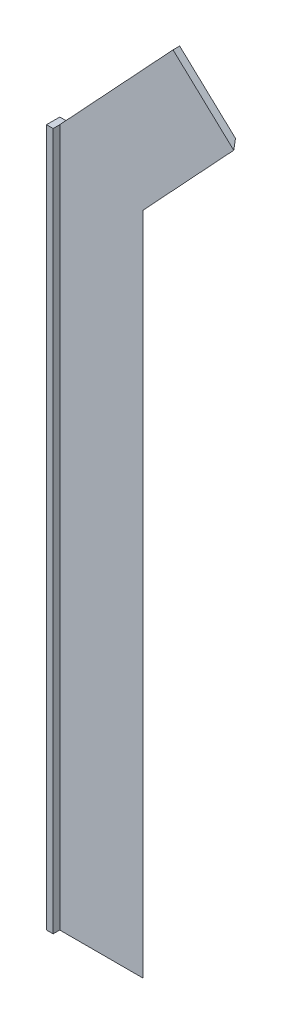
ISO-10303-21;
HEADER;
FILE_DESCRIPTION(('STEP AP214'),'2;1');
FILE_NAME('part.step','',(''),(''),'','','');
FILE_SCHEMA(('AUTOMOTIVE_DESIGN { 1 0 10303 214 1 1 1 1 }'));
ENDSEC;
DATA;
#1=APPLICATION_CONTEXT('core data for automotive mechanical design processes');
#2=APPLICATION_PROTOCOL_DEFINITION('international standard','automotive_design',2000,#1);
#3=PRODUCT_CONTEXT('',#1,'mechanical');
#4=PRODUCT('Part','Part','',(#3));
#5=PRODUCT_RELATED_PRODUCT_CATEGORY('part','',(#4));
#6=PRODUCT_DEFINITION_FORMATION('','',#4);
#7=PRODUCT_DEFINITION_CONTEXT('part definition',#1,'design');
#8=PRODUCT_DEFINITION('design','',#6,#7);
#9=PRODUCT_DEFINITION_SHAPE('','',#8);
#10=(LENGTH_UNIT() NAMED_UNIT(*) SI_UNIT(.MILLI.,.METRE.));
#11=(NAMED_UNIT(*) PLANE_ANGLE_UNIT() SI_UNIT($,.RADIAN.));
#12=(NAMED_UNIT(*) SI_UNIT($,.STERADIAN.) SOLID_ANGLE_UNIT());
#13=UNCERTAINTY_MEASURE_WITH_UNIT(LENGTH_MEASURE(1.E-05),#10,'distance_accuracy_value','');
#14=(GEOMETRIC_REPRESENTATION_CONTEXT(3) GLOBAL_UNCERTAINTY_ASSIGNED_CONTEXT((#13)) GLOBAL_UNIT_ASSIGNED_CONTEXT((#10,
#11,#12)) REPRESENTATION_CONTEXT('',''));
#15=CARTESIAN_POINT('',(0.,0.,0.));
#16=DIRECTION('',(0.,0.,1.));
#17=DIRECTION('',(1.,0.,0.));
#18=AXIS2_PLACEMENT_3D('',#15,#16,#17);
#19=CARTESIAN_POINT('',(0.,50.4323149190414,2.));
#20=DIRECTION('',(0.,1.,0.));
#21=DIRECTION('',(-1.,0.,0.));
#22=AXIS2_PLACEMENT_3D('',#19,#20,#21);
#23=PLANE('',#22);
#24=DIRECTION('',(1.,0.,0.));
#25=VECTOR('',#24,1.);
#26=CARTESIAN_POINT('',(0.,50.4323149190414,0.));
#27=LINE('',#26,#25);
#28=CARTESIAN_POINT('',(-2.,50.4323149190414,0.));
#29=VERTEX_POINT('',#28);
#30=CARTESIAN_POINT('',(23.,50.4323149190415,0.));
#31=VERTEX_POINT('',#30);
#32=EDGE_CURVE('E97',#29,#31,#27,.T.);
#33=ORIENTED_EDGE('',*,*,#32,.T.);
#34=DIRECTION('',(0.707106781186543,0.,0.707106781186552));
#35=VECTOR('',#34,1.);
#36=CARTESIAN_POINT('',(25.,50.4323149190415,2.));
#37=LINE('',#36,#35);
#38=CARTESIAN_POINT('',(25.,50.4323149190415,2.));
#39=VERTEX_POINT('',#38);
#40=EDGE_CURVE('E11',#31,#39,#37,.T.);
#41=ORIENTED_EDGE('',*,*,#40,.T.);
#42=DIRECTION('',(1.,0.,0.));
#43=VECTOR('',#42,1.);
#44=CARTESIAN_POINT('',(0.,50.4323149190414,2.));
#45=LINE('',#44,#43);
#46=CARTESIAN_POINT('',(0.,50.4323149190414,2.));
#47=VERTEX_POINT('',#46);
#48=EDGE_CURVE('E144',#47,#39,#45,.T.);
#49=ORIENTED_EDGE('',*,*,#48,.F.);
#50=DIRECTION('',(0.,0.,1.));
#51=VECTOR('',#50,1.);
#52=CARTESIAN_POINT('',(0.,50.4323149190414,0.));
#53=LINE('',#52,#51);
#54=CARTESIAN_POINT('',(0.,50.4323149190414,4.00000000000003));
#55=VERTEX_POINT('',#54);
#56=EDGE_CURVE('E132',#47,#55,#53,.T.);
#57=ORIENTED_EDGE('',*,*,#56,.T.);
#58=DIRECTION('',(1.,0.,0.));
#59=VECTOR('',#58,1.);
#60=CARTESIAN_POINT('',(-2.,50.4323149190414,4.00000000000003));
#61=LINE('',#60,#59);
#62=CARTESIAN_POINT('',(-2.,50.4323149190414,4.00000000000003));
#63=VERTEX_POINT('',#62);
#64=EDGE_CURVE('E106',#63,#55,#61,.T.);
#65=ORIENTED_EDGE('',*,*,#64,.F.);
#66=DIRECTION('',(0.,0.,1.));
#67=VECTOR('',#66,1.);
#68=CARTESIAN_POINT('',(-2.,50.4323149190414,0.));
#69=LINE('',#68,#67);
#70=EDGE_CURVE('E109',#29,#63,#69,.T.);
#71=ORIENTED_EDGE('',*,*,#70,.F.);
#72=EDGE_LOOP('',(#33,#41,#49,#57,#65,#71));
#73=FACE_BOUND('',#72,.T.);
#74=ADVANCED_FACE('F33',(#73),#23,.F.);
#75=CARTESIAN_POINT('',(34.0999180031248,297.,2.));
#76=DIRECTION('',(-0.681998360062497,-0.731353701619172,0.));
#77=DIRECTION('',(0.731353701619172,-0.681998360062497,0.));
#78=AXIS2_PLACEMENT_3D('',#75,#76,#77);
#79=PLANE('',#78);
#80=DIRECTION('',(-0.731353701619172,0.681998360062497,0.));
#81=VECTOR('',#80,1.);
#82=CARTESIAN_POINT('',(34.0999180031248,297.,2.));
#83=LINE('',#82,#81);
#84=CARTESIAN_POINT('',(52.3837605436042,279.950040998437,2.));
#85=VERTEX_POINT('',#84);
#86=CARTESIAN_POINT('',(34.0999180031248,297.,2.));
#87=VERTEX_POINT('',#86);
#88=EDGE_CURVE('E152',#85,#87,#83,.T.);
#89=ORIENTED_EDGE('',*,*,#88,.F.);
#90=DIRECTION('',(-0.517145161860798,0.482245665158295,-0.70710678118655));
#91=VECTOR('',#90,1.);
#92=CARTESIAN_POINT('',(52.3837605436042,279.950040998437,2.00000000000003));
#93=LINE('',#92,#91);
#94=CARTESIAN_POINT('',(50.9210531403658,281.314037718563,0.));
#95=VERTEX_POINT('',#94);
#96=EDGE_CURVE('E159',#85,#95,#93,.T.);
#97=ORIENTED_EDGE('',*,*,#96,.T.);
#98=DIRECTION('',(-0.731353701619172,0.681998360062497,0.));
#99=VECTOR('',#98,1.);
#100=CARTESIAN_POINT('',(34.0999180031248,297.,0.));
#101=LINE('',#100,#99);
#102=CARTESIAN_POINT('',(34.0999180031248,297.,0.));
#103=VERTEX_POINT('',#102);
#104=EDGE_CURVE('E105',#95,#103,#101,.T.);
#105=ORIENTED_EDGE('',*,*,#104,.T.);
#106=DIRECTION('',(0.,0.,-1.));
#107=VECTOR('',#106,1.);
#108=CARTESIAN_POINT('',(34.0999180031248,297.,2.));
#109=LINE('',#108,#107);
#110=EDGE_CURVE('E156',#87,#103,#109,.T.);
#111=ORIENTED_EDGE('',*,*,#110,.F.);
#112=EDGE_LOOP('',(#89,#97,#105,#111));
#113=FACE_BOUND('',#112,.T.);
#114=ADVANCED_FACE('F199',(#113),#79,.F.);
#115=CARTESIAN_POINT('',(0.,260.432314919041,2.));
#116=DIRECTION('',(0.731353701619172,-0.681998360062497,0.));
#117=DIRECTION('',(0.681998360062497,0.731353701619172,0.));
#118=AXIS2_PLACEMENT_3D('',#115,#116,#117);
#119=PLANE('',#118);
#120=DIRECTION('',(-0.681998360062497,-0.731353701619172,0.));
#121=VECTOR('',#120,1.);
#122=CARTESIAN_POINT('',(0.,260.432314919041,0.));
#123=LINE('',#122,#121);
#124=CARTESIAN_POINT('',(0.,260.432314919041,0.));
#125=VERTEX_POINT('',#124);
#126=EDGE_CURVE('E145',#103,#125,#123,.T.);
#127=ORIENTED_EDGE('',*,*,#126,.T.);
#128=DIRECTION('',(0.,0.,-1.));
#129=VECTOR('',#128,1.);
#130=CARTESIAN_POINT('',(0.,260.432314919041,2.));
#131=LINE('',#130,#129);
#132=CARTESIAN_POINT('',(0.,260.432314919041,2.));
#133=VERTEX_POINT('',#132);
#134=EDGE_CURVE('E151',#133,#125,#131,.T.);
#135=ORIENTED_EDGE('',*,*,#134,.F.);
#136=DIRECTION('',(-0.681998360062497,-0.731353701619172,0.));
#137=VECTOR('',#136,1.);
#138=CARTESIAN_POINT('',(0.,260.432314919041,2.));
#139=LINE('',#138,#137);
#140=EDGE_CURVE('E148',#87,#133,#139,.T.);
#141=ORIENTED_EDGE('',*,*,#140,.F.);
#142=ORIENTED_EDGE('',*,*,#110,.T.);
#143=EDGE_LOOP('',(#127,#135,#141,#142));
#144=FACE_BOUND('',#143,.T.);
#145=ADVANCED_FACE('F183',(#144),#119,.F.);
#146=CARTESIAN_POINT('',(0.,0.,2.));
#147=DIRECTION('',(0.,0.,-1.));
#148=DIRECTION('',(-1.,0.,0.));
#149=AXIS2_PLACEMENT_3D('',#146,#147,#148);
#150=PLANE('',#149);
#151=DIRECTION('',(0.,-1.,0.));
#152=VECTOR('',#151,1.);
#153=CARTESIAN_POINT('',(0.,50.4323149190414,2.));
#154=LINE('',#153,#152);
#155=EDGE_CURVE('E140',#133,#47,#154,.T.);
#156=ORIENTED_EDGE('',*,*,#155,.T.);
#157=ORIENTED_EDGE('',*,*,#48,.T.);
#158=DIRECTION('',(0.,1.,0.));
#159=VECTOR('',#158,1.);
#160=CARTESIAN_POINT('',(25.,50.4323149190415,2.));
#161=LINE('',#160,#159);
#162=CARTESIAN_POINT('',(25.,250.584553028668,2.));
#163=VERTEX_POINT('',#162);
#164=EDGE_CURVE('E137',#39,#163,#161,.T.);
#165=ORIENTED_EDGE('',*,*,#164,.T.);
#166=DIRECTION('',(0.681998360062496,0.731353701619172,0.));
#167=VECTOR('',#166,1.);
#168=CARTESIAN_POINT('',(25.,250.584553028668,2.));
#169=LINE('',#168,#167);
#170=EDGE_CURVE('E177',#163,#85,#169,.T.);
#171=ORIENTED_EDGE('',*,*,#170,.T.);
#172=ORIENTED_EDGE('',*,*,#88,.T.);
#173=ORIENTED_EDGE('',*,*,#140,.T.);
#174=EDGE_LOOP('',(#156,#157,#165,#171,#172,#173));
#175=FACE_BOUND('',#174,.T.);
#176=ADVANCED_FACE('F198',(#175),#150,.F.);
#177=CARTESIAN_POINT('',(0.,0.,0.));
#178=DIRECTION('',(0.,0.,-1.));
#179=DIRECTION('',(-1.,0.,0.));
#180=AXIS2_PLACEMENT_3D('',#177,#178,#179);
#181=PLANE('',#180);
#182=ORIENTED_EDGE('',*,*,#104,.F.);
#183=DIRECTION('',(-0.681998360062496,-0.731353701619173,0.));
#184=VECTOR('',#183,1.);
#185=CARTESIAN_POINT('',(23.5372925967617,251.948549748793,0.));
#186=LINE('',#185,#184);
#187=CARTESIAN_POINT('',(23.,251.372373979898,0.));
#188=VERTEX_POINT('',#187);
#189=EDGE_CURVE('E42',#95,#188,#186,.T.);
#190=ORIENTED_EDGE('',*,*,#189,.T.);
#191=DIRECTION('',(0.,-1.,0.));
#192=VECTOR('',#191,1.);
#193=CARTESIAN_POINT('',(23.,50.4323149190415,0.));
#194=LINE('',#193,#192);
#195=EDGE_CURVE('E52',#188,#31,#194,.T.);
#196=ORIENTED_EDGE('',*,*,#195,.T.);
#197=ORIENTED_EDGE('',*,*,#32,.F.);
#198=DIRECTION('',(0.,-1.,0.));
#199=VECTOR('',#198,1.);
#200=CARTESIAN_POINT('',(-2.,260.432314919041,0.));
#201=LINE('',#200,#199);
#202=CARTESIAN_POINT('',(-2.,260.432314919041,0.));
#203=VERTEX_POINT('',#202);
#204=EDGE_CURVE('E102',#203,#29,#201,.T.);
#205=ORIENTED_EDGE('',*,*,#204,.F.);
#206=DIRECTION('',(1.,0.,0.));
#207=VECTOR('',#206,1.);
#208=CARTESIAN_POINT('',(-2.,260.432314919041,0.));
#209=LINE('',#208,#207);
#210=EDGE_CURVE('E127',#203,#125,#209,.T.);
#211=ORIENTED_EDGE('',*,*,#210,.T.);
#212=ORIENTED_EDGE('',*,*,#126,.F.);
#213=EDGE_LOOP('',(#182,#190,#196,#197,#205,#211,#212));
#214=FACE_BOUND('',#213,.T.);
#215=ADVANCED_FACE('F99',(#214),#181,.T.);
#216=CARTESIAN_POINT('',(-2.,260.432314919041,4.));
#217=DIRECTION('',(0.,0.,-1.));
#218=DIRECTION('',(0.,1.,0.));
#219=AXIS2_PLACEMENT_3D('',#216,#217,#218);
#220=PLANE('',#219);
#221=DIRECTION('',(0.,1.,0.));
#222=VECTOR('',#221,1.);
#223=CARTESIAN_POINT('',(0.,260.432314919041,4.));
#224=LINE('',#223,#222);
#225=CARTESIAN_POINT('',(0.,260.432314919041,4.));
#226=VERTEX_POINT('',#225);
#227=EDGE_CURVE('E122',#55,#226,#224,.T.);
#228=ORIENTED_EDGE('',*,*,#227,.T.);
#229=DIRECTION('',(1.,0.,0.));
#230=VECTOR('',#229,1.);
#231=CARTESIAN_POINT('',(-2.,260.432314919041,4.));
#232=LINE('',#231,#230);
#233=CARTESIAN_POINT('',(-2.,260.432314919041,4.));
#234=VERTEX_POINT('',#233);
#235=EDGE_CURVE('E185',#234,#226,#232,.T.);
#236=ORIENTED_EDGE('',*,*,#235,.F.);
#237=DIRECTION('',(0.,1.,0.));
#238=VECTOR('',#237,1.);
#239=CARTESIAN_POINT('',(-2.,260.432314919041,4.));
#240=LINE('',#239,#238);
#241=EDGE_CURVE('E113',#63,#234,#240,.T.);
#242=ORIENTED_EDGE('',*,*,#241,.F.);
#243=ORIENTED_EDGE('',*,*,#64,.T.);
#244=EDGE_LOOP('',(#228,#236,#242,#243));
#245=FACE_BOUND('',#244,.T.);
#246=ADVANCED_FACE('F192',(#245),#220,.F.);
#247=CARTESIAN_POINT('',(-2.,260.432314919041,0.));
#248=DIRECTION('',(0.,-1.,0.));
#249=DIRECTION('',(1.,0.,0.));
#250=AXIS2_PLACEMENT_3D('',#247,#248,#249);
#251=PLANE('',#250);
#252=DIRECTION('',(0.,0.,-1.));
#253=VECTOR('',#252,1.);
#254=CARTESIAN_POINT('',(0.,260.432314919041,0.));
#255=LINE('',#254,#253);
#256=EDGE_CURVE('E119',#226,#133,#255,.T.);
#257=ORIENTED_EDGE('',*,*,#256,.T.);
#258=ORIENTED_EDGE('',*,*,#134,.T.);
#259=ORIENTED_EDGE('',*,*,#210,.F.);
#260=DIRECTION('',(0.,0.,-1.));
#261=VECTOR('',#260,1.);
#262=CARTESIAN_POINT('',(-2.,260.432314919041,0.));
#263=LINE('',#262,#261);
#264=EDGE_CURVE('E117',#234,#203,#263,.T.);
#265=ORIENTED_EDGE('',*,*,#264,.F.);
#266=ORIENTED_EDGE('',*,*,#235,.T.);
#267=EDGE_LOOP('',(#257,#258,#259,#265,#266));
#268=FACE_BOUND('',#267,.T.);
#269=ADVANCED_FACE('F197',(#268),#251,.F.);
#270=CARTESIAN_POINT('',(-2.,0.,0.));
#271=DIRECTION('',(-1.,0.,0.));
#272=DIRECTION('',(0.,-1.,0.));
#273=AXIS2_PLACEMENT_3D('',#270,#271,#272);
#274=PLANE('',#273);
#275=ORIENTED_EDGE('',*,*,#204,.T.);
#276=ORIENTED_EDGE('',*,*,#70,.T.);
#277=ORIENTED_EDGE('',*,*,#241,.T.);
#278=ORIENTED_EDGE('',*,*,#264,.T.);
#279=EDGE_LOOP('',(#275,#276,#277,#278));
#280=FACE_BOUND('',#279,.T.);
#281=ADVANCED_FACE('F115',(#280),#274,.T.);
#282=CARTESIAN_POINT('',(0.,0.,0.));
#283=DIRECTION('',(-1.,0.,0.));
#284=DIRECTION('',(0.,-1.,0.));
#285=AXIS2_PLACEMENT_3D('',#282,#283,#284);
#286=PLANE('',#285);
#287=ORIENTED_EDGE('',*,*,#155,.F.);
#288=ORIENTED_EDGE('',*,*,#256,.F.);
#289=ORIENTED_EDGE('',*,*,#227,.F.);
#290=ORIENTED_EDGE('',*,*,#56,.F.);
#291=EDGE_LOOP('',(#287,#288,#289,#290));
#292=FACE_BOUND('',#291,.T.);
#293=ADVANCED_FACE('F196',(#292),#286,.F.);
#294=CARTESIAN_POINT('',(25.,50.4323149190415,2.));
#295=DIRECTION('',(0.707106781186552,0.,-0.707106781186543));
#296=DIRECTION('',(0.,-1.,0.));
#297=AXIS2_PLACEMENT_3D('',#294,#295,#296);
#298=PLANE('',#297);
#299=ORIENTED_EDGE('',*,*,#40,.F.);
#300=ORIENTED_EDGE('',*,*,#195,.F.);
#301=DIRECTION('',(0.681176553124082,-0.268322580018859,0.681176553124091));
#302=VECTOR('',#301,1.);
#303=CARTESIAN_POINT('',(25.,250.584553028668,2.));
#304=LINE('',#303,#302);
#305=EDGE_CURVE('E37',#163,#188,#304,.F.);
#306=ORIENTED_EDGE('',*,*,#305,.F.);
#307=ORIENTED_EDGE('',*,*,#164,.F.);
#308=EDGE_LOOP('',(#299,#300,#306,#307));
#309=FACE_BOUND('',#308,.T.);
#310=ADVANCED_FACE('F35',(#309),#298,.T.);
#311=CARTESIAN_POINT('',(25.,250.584553028668,2.));
#312=DIRECTION('',(0.517145161860802,-0.482245665158298,-0.707106781186545));
#313=DIRECTION('',(-0.681998360062496,-0.731353701619173,0.));
#314=AXIS2_PLACEMENT_3D('',#311,#312,#313);
#315=PLANE('',#314);
#316=ORIENTED_EDGE('',*,*,#305,.T.);
#317=ORIENTED_EDGE('',*,*,#189,.F.);
#318=ORIENTED_EDGE('',*,*,#96,.F.);
#319=ORIENTED_EDGE('',*,*,#170,.F.);
#320=EDGE_LOOP('',(#316,#317,#318,#319));
#321=FACE_BOUND('',#320,.T.);
#322=ADVANCED_FACE('F209',(#321),#315,.T.);
#323=CLOSED_SHELL('',(#74,#114,#145,#176,#215,#246,#269,#281,#293,#310,#322));
#324=MANIFOLD_SOLID_BREP('B2',#323);
#325=ADVANCED_BREP_SHAPE_REPRESENTATION('',(#18,#324),#14);
#326=SHAPE_DEFINITION_REPRESENTATION(#9,#325);
ENDSEC;
END-ISO-10303-21;
